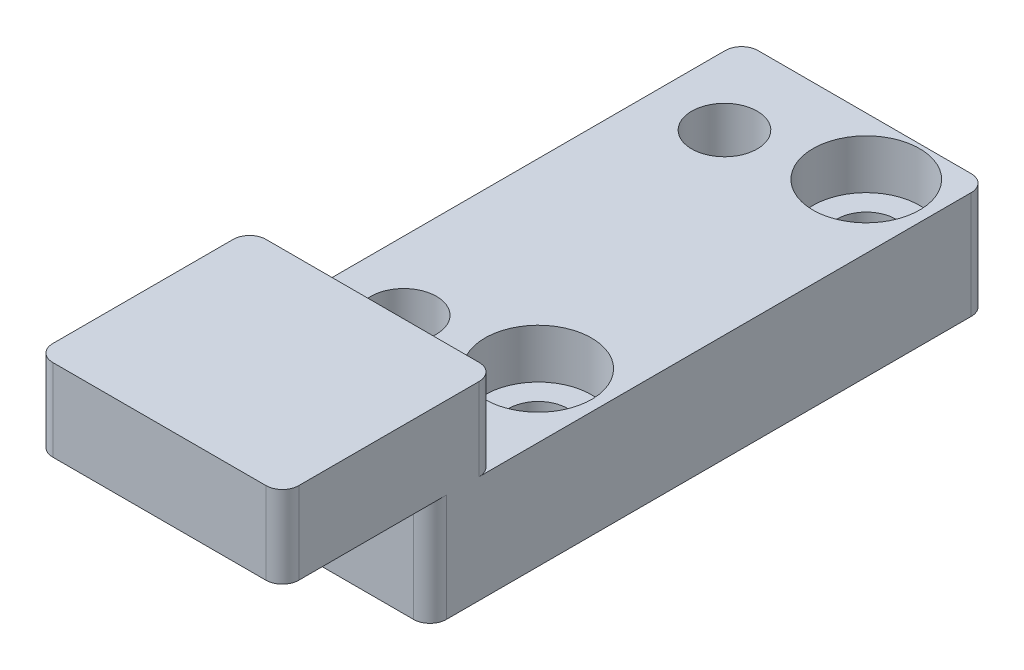
ISO-10303-21;
HEADER;
FILE_DESCRIPTION(('STEP AP214'),'2;1');
FILE_NAME('part.step','',(''),(''),'','','');
FILE_SCHEMA(('AUTOMOTIVE_DESIGN { 1 0 10303 214 1 1 1 1 }'));
ENDSEC;
DATA;
#1=APPLICATION_CONTEXT('core data for automotive mechanical design processes');
#2=APPLICATION_PROTOCOL_DEFINITION('international standard','automotive_design',2000,#1);
#3=PRODUCT_CONTEXT('',#1,'mechanical');
#4=PRODUCT('Part','Part','',(#3));
#5=PRODUCT_RELATED_PRODUCT_CATEGORY('part','',(#4));
#6=PRODUCT_DEFINITION_FORMATION('','',#4);
#7=PRODUCT_DEFINITION_CONTEXT('part definition',#1,'design');
#8=PRODUCT_DEFINITION('design','',#6,#7);
#9=PRODUCT_DEFINITION_SHAPE('','',#8);
#10=(LENGTH_UNIT() NAMED_UNIT(*) SI_UNIT(.MILLI.,.METRE.));
#11=(NAMED_UNIT(*) PLANE_ANGLE_UNIT() SI_UNIT($,.RADIAN.));
#12=(NAMED_UNIT(*) SI_UNIT($,.STERADIAN.) SOLID_ANGLE_UNIT());
#13=UNCERTAINTY_MEASURE_WITH_UNIT(LENGTH_MEASURE(1.E-05),#10,'distance_accuracy_value','');
#14=(GEOMETRIC_REPRESENTATION_CONTEXT(3) GLOBAL_UNCERTAINTY_ASSIGNED_CONTEXT((#13)) GLOBAL_UNIT_ASSIGNED_CONTEXT((#10,
#11,#12)) REPRESENTATION_CONTEXT('',''));
#15=CARTESIAN_POINT('',(0.,0.,0.));
#16=DIRECTION('',(0.,0.,1.));
#17=DIRECTION('',(1.,0.,0.));
#18=AXIS2_PLACEMENT_3D('',#15,#16,#17);
#19=CARTESIAN_POINT('',(0.,0.,30.));
#20=DIRECTION('',(0.,1.,0.));
#21=DIRECTION('',(0.,0.,1.));
#22=AXIS2_PLACEMENT_3D('',#19,#20,#21);
#23=PLANE('',#22);
#24=CARTESIAN_POINT('',(11.0999999999768,0.,3.49999999996773));
#25=DIRECTION('',(0.,1.,0.));
#26=DIRECTION('',(0.,0.,1.));
#27=AXIS2_PLACEMENT_3D('',#24,#25,#26);
#28=CIRCLE('',#27,1.8);
#29=CARTESIAN_POINT('',(11.0999999999768,0.,5.29999999996772));
#30=VERTEX_POINT('',#29);
#31=EDGE_CURVE('E277',#30,#30,#28,.T.);
#32=ORIENTED_EDGE('',*,*,#31,.T.);
#33=EDGE_LOOP('',(#32));
#34=FACE_BOUND('',#33,.T.);
#35=CARTESIAN_POINT('',(11.0999999999768,0.,23.4999999999677));
#36=DIRECTION('',(0.,1.,0.));
#37=DIRECTION('',(0.,0.,1.));
#38=AXIS2_PLACEMENT_3D('',#35,#36,#37);
#39=CIRCLE('',#38,1.8);
#40=CARTESIAN_POINT('',(11.0999999999768,0.,25.2999999999677));
#41=VERTEX_POINT('',#40);
#42=EDGE_CURVE('E263',#41,#41,#39,.T.);
#43=ORIENTED_EDGE('',*,*,#42,.T.);
#44=EDGE_LOOP('',(#43));
#45=FACE_BOUND('',#44,.T.);
#46=DIRECTION('',(0.,0.,-1.));
#47=VECTOR('',#46,1.);
#48=CARTESIAN_POINT('',(0.,0.,30.));
#49=LINE('',#48,#47);
#50=CARTESIAN_POINT('',(0.,0.,32.9999999999997));
#51=VERTEX_POINT('',#50);
#52=CARTESIAN_POINT('',(0.,0.,1.));
#53=VERTEX_POINT('',#52);
#54=EDGE_CURVE('E151',#51,#53,#49,.T.);
#55=ORIENTED_EDGE('',*,*,#54,.T.);
#56=CARTESIAN_POINT('',(1.,0.,1.));
#57=DIRECTION('',(0.,1.,0.));
#58=DIRECTION('',(0.,0.,1.));
#59=AXIS2_PLACEMENT_3D('',#56,#57,#58);
#60=CIRCLE('',#59,1.);
#61=CARTESIAN_POINT('',(1.,0.,0.));
#62=VERTEX_POINT('',#61);
#63=EDGE_CURVE('E184',#53,#62,#60,.F.);
#64=ORIENTED_EDGE('',*,*,#63,.T.);
#65=DIRECTION('',(1.,0.,0.));
#66=VECTOR('',#65,1.);
#67=CARTESIAN_POINT('',(0.,0.,0.));
#68=LINE('',#67,#66);
#69=CARTESIAN_POINT('',(14.,0.,0.));
#70=VERTEX_POINT('',#69);
#71=EDGE_CURVE('E261',#62,#70,#68,.T.);
#72=ORIENTED_EDGE('',*,*,#71,.T.);
#73=CARTESIAN_POINT('',(14.,0.,1.));
#74=DIRECTION('',(0.,1.,0.));
#75=DIRECTION('',(0.,0.,1.));
#76=AXIS2_PLACEMENT_3D('',#73,#74,#75);
#77=CIRCLE('',#76,1.);
#78=CARTESIAN_POINT('',(15.,0.,1.));
#79=VERTEX_POINT('',#78);
#80=EDGE_CURVE('E182',#70,#79,#77,.F.);
#81=ORIENTED_EDGE('',*,*,#80,.T.);
#82=DIRECTION('',(0.,0.,-1.));
#83=VECTOR('',#82,1.);
#84=CARTESIAN_POINT('',(15.,0.,30.));
#85=LINE('',#84,#83);
#86=CARTESIAN_POINT('',(15.,0.,32.9999999999997));
#87=VERTEX_POINT('',#86);
#88=EDGE_CURVE('E169',#87,#79,#85,.T.);
#89=ORIENTED_EDGE('',*,*,#88,.F.);
#90=CARTESIAN_POINT('',(14.,0.,32.9999999999997));
#91=DIRECTION('',(0.,1.,0.));
#92=DIRECTION('',(0.,0.,1.));
#93=AXIS2_PLACEMENT_3D('',#90,#91,#92);
#94=CIRCLE('',#93,1.);
#95=CARTESIAN_POINT('',(14.,0.,33.9999999999997));
#96=VERTEX_POINT('',#95);
#97=EDGE_CURVE('E157',#87,#96,#94,.F.);
#98=ORIENTED_EDGE('',*,*,#97,.T.);
#99=DIRECTION('',(-1.,0.,0.));
#100=VECTOR('',#99,1.);
#101=CARTESIAN_POINT('',(32.4023492954205,0.,33.9999999999997));
#102=LINE('',#101,#100);
#103=CARTESIAN_POINT('',(1.,0.,33.9999999999997));
#104=VERTEX_POINT('',#103);
#105=EDGE_CURVE('E153',#96,#104,#102,.T.);
#106=ORIENTED_EDGE('',*,*,#105,.T.);
#107=CARTESIAN_POINT('',(1.,0.,32.9999999999997));
#108=DIRECTION('',(0.,1.,0.));
#109=DIRECTION('',(0.,0.,1.));
#110=AXIS2_PLACEMENT_3D('',#107,#108,#109);
#111=CIRCLE('',#110,1.);
#112=EDGE_CURVE('E148',#104,#51,#111,.F.);
#113=ORIENTED_EDGE('',*,*,#112,.T.);
#114=EDGE_LOOP('',(#55,#64,#72,#81,#89,#98,#106,#113));
#115=FACE_BOUND('',#114,.T.);
#116=CARTESIAN_POINT('',(4.17499999999833,0.,5.22100000000145));
#117=DIRECTION('',(0.,-1.,0.));
#118=DIRECTION('',(0.,0.,-1.));
#119=AXIS2_PLACEMENT_3D('',#116,#117,#118);
#120=CIRCLE('',#119,3.57251);
#121=CARTESIAN_POINT('',(4.17499999999833,0.,1.64849000000145));
#122=VERTEX_POINT('',#121);
#123=EDGE_CURVE('E298',#122,#122,#120,.T.);
#124=ORIENTED_EDGE('',*,*,#123,.F.);
#125=EDGE_LOOP('',(#124));
#126=FACE_BOUND('',#125,.T.);
#127=CARTESIAN_POINT('',(4.17499999999827,0.,24.7790000000014));
#128=DIRECTION('',(0.,-1.,0.));
#129=DIRECTION('',(0.,0.,-1.));
#130=AXIS2_PLACEMENT_3D('',#127,#128,#129);
#131=CIRCLE('',#130,3.57251);
#132=CARTESIAN_POINT('',(4.17499999999827,0.,21.2064900000014));
#133=VERTEX_POINT('',#132);
#134=EDGE_CURVE('E310',#133,#133,#131,.T.);
#135=ORIENTED_EDGE('',*,*,#134,.F.);
#136=EDGE_LOOP('',(#135));
#137=FACE_BOUND('',#136,.T.);
#138=ADVANCED_FACE('F34',(#34,#45,#115,#126,#137),#23,.F.);
#139=CARTESIAN_POINT('',(0.,0.,30.));
#140=DIRECTION('',(1.,0.,0.));
#141=DIRECTION('',(0.,0.,-1.));
#142=AXIS2_PLACEMENT_3D('',#139,#140,#141);
#143=PLANE('',#142);
#144=DIRECTION('',(0.,0.,-1.));
#145=VECTOR('',#144,1.);
#146=CARTESIAN_POINT('',(0.,6.539,30.));
#147=LINE('',#146,#145);
#148=CARTESIAN_POINT('',(0.,6.539,30.9999999999998));
#149=VERTEX_POINT('',#148);
#150=CARTESIAN_POINT('',(0.,6.539,1.));
#151=VERTEX_POINT('',#150);
#152=EDGE_CURVE('E253',#149,#151,#147,.T.);
#153=ORIENTED_EDGE('',*,*,#152,.T.);
#154=DIRECTION('',(0.,-1.,0.));
#155=VECTOR('',#154,1.);
#156=CARTESIAN_POINT('',(0.,0.,1.));
#157=LINE('',#156,#155);
#158=EDGE_CURVE('E158',#151,#53,#157,.T.);
#159=ORIENTED_EDGE('',*,*,#158,.T.);
#160=ORIENTED_EDGE('',*,*,#54,.F.);
#161=DIRECTION('',(0.,1.,0.));
#162=VECTOR('',#161,1.);
#163=CARTESIAN_POINT('',(0.,6.56899999999228,32.9999999999997));
#164=LINE('',#163,#162);
#165=CARTESIAN_POINT('',(0.,6.56899999999228,32.9999999999997));
#166=VERTEX_POINT('',#165);
#167=EDGE_CURVE('E166',#51,#166,#164,.T.);
#168=ORIENTED_EDGE('',*,*,#167,.T.);
#169=DIRECTION('',(0.,0.,1.));
#170=VECTOR('',#169,1.);
#171=CARTESIAN_POINT('',(0.,6.56899999999228,33.9999999999997));
#172=LINE('',#171,#170);
#173=CARTESIAN_POINT('',(0.,6.56899999999228,41.9999999999997));
#174=VERTEX_POINT('',#173);
#175=EDGE_CURVE('E326',#166,#174,#172,.T.);
#176=ORIENTED_EDGE('',*,*,#175,.T.);
#177=DIRECTION('',(0.,1.,0.));
#178=VECTOR('',#177,1.);
#179=CARTESIAN_POINT('',(0.,11.5689999999923,41.9999999999997));
#180=LINE('',#179,#178);
#181=CARTESIAN_POINT('',(0.,11.5689999999923,41.9999999999997));
#182=VERTEX_POINT('',#181);
#183=EDGE_CURVE('E168',#174,#182,#180,.T.);
#184=ORIENTED_EDGE('',*,*,#183,.T.);
#185=DIRECTION('',(0.,0.,-1.));
#186=VECTOR('',#185,1.);
#187=CARTESIAN_POINT('',(0.,11.5689999999923,42.9999999999997));
#188=LINE('',#187,#186);
#189=CARTESIAN_POINT('',(0.,11.5689999999923,30.9999999999997));
#190=VERTEX_POINT('',#189);
#191=EDGE_CURVE('E315',#182,#190,#188,.T.);
#192=ORIENTED_EDGE('',*,*,#191,.T.);
#193=DIRECTION('',(0.,-1.,0.));
#194=VECTOR('',#193,1.);
#195=CARTESIAN_POINT('',(0.,6.53900000000003,30.9999999999998));
#196=LINE('',#195,#194);
#197=EDGE_CURVE('E173',#190,#149,#196,.T.);
#198=ORIENTED_EDGE('',*,*,#197,.T.);
#199=EDGE_LOOP('',(#153,#159,#160,#168,#176,#184,#192,#198));
#200=FACE_BOUND('',#199,.T.);
#201=ADVANCED_FACE('F164',(#200),#143,.F.);
#202=CARTESIAN_POINT('',(15.,0.,30.));
#203=DIRECTION('',(-1.,0.,0.));
#204=DIRECTION('',(0.,0.,1.));
#205=AXIS2_PLACEMENT_3D('',#202,#203,#204);
#206=PLANE('',#205);
#207=ORIENTED_EDGE('',*,*,#88,.T.);
#208=DIRECTION('',(0.,1.,0.));
#209=VECTOR('',#208,1.);
#210=CARTESIAN_POINT('',(15.,6.539,1.));
#211=LINE('',#210,#209);
#212=CARTESIAN_POINT('',(15.,6.539,1.));
#213=VERTEX_POINT('',#212);
#214=EDGE_CURVE('E215',#79,#213,#211,.T.);
#215=ORIENTED_EDGE('',*,*,#214,.T.);
#216=DIRECTION('',(0.,0.,-1.));
#217=VECTOR('',#216,1.);
#218=CARTESIAN_POINT('',(15.,6.539,30.));
#219=LINE('',#218,#217);
#220=CARTESIAN_POINT('',(15.,6.539,30.9999999999998));
#221=VERTEX_POINT('',#220);
#222=EDGE_CURVE('E250',#221,#213,#219,.T.);
#223=ORIENTED_EDGE('',*,*,#222,.F.);
#224=DIRECTION('',(0.,1.,0.));
#225=VECTOR('',#224,1.);
#226=CARTESIAN_POINT('',(15.,11.5689999999923,30.9999999999997));
#227=LINE('',#226,#225);
#228=CARTESIAN_POINT('',(15.,11.5689999999923,30.9999999999997));
#229=VERTEX_POINT('',#228);
#230=EDGE_CURVE('E212',#221,#229,#227,.T.);
#231=ORIENTED_EDGE('',*,*,#230,.T.);
#232=DIRECTION('',(0.,0.,1.));
#233=VECTOR('',#232,1.);
#234=CARTESIAN_POINT('',(15.,11.5689999999923,42.9999999999997));
#235=LINE('',#234,#233);
#236=CARTESIAN_POINT('',(15.,11.5689999999923,41.9999999999997));
#237=VERTEX_POINT('',#236);
#238=EDGE_CURVE('E313',#229,#237,#235,.T.);
#239=ORIENTED_EDGE('',*,*,#238,.T.);
#240=DIRECTION('',(0.,-1.,0.));
#241=VECTOR('',#240,1.);
#242=CARTESIAN_POINT('',(15.,6.56899999999228,41.9999999999997));
#243=LINE('',#242,#241);
#244=CARTESIAN_POINT('',(15.,6.56899999999228,41.9999999999997));
#245=VERTEX_POINT('',#244);
#246=EDGE_CURVE('E206',#237,#245,#243,.T.);
#247=ORIENTED_EDGE('',*,*,#246,.T.);
#248=DIRECTION('',(0.,0.,-1.));
#249=VECTOR('',#248,1.);
#250=CARTESIAN_POINT('',(15.,6.56899999999228,33.9999999999997));
#251=LINE('',#250,#249);
#252=CARTESIAN_POINT('',(15.,6.56899999999228,32.9999999999997));
#253=VERTEX_POINT('',#252);
#254=EDGE_CURVE('E237',#245,#253,#251,.T.);
#255=ORIENTED_EDGE('',*,*,#254,.T.);
#256=DIRECTION('',(0.,-1.,0.));
#257=VECTOR('',#256,1.);
#258=CARTESIAN_POINT('',(15.,0.,32.9999999999997));
#259=LINE('',#258,#257);
#260=EDGE_CURVE('E209',#253,#87,#259,.T.);
#261=ORIENTED_EDGE('',*,*,#260,.T.);
#262=EDGE_LOOP('',(#207,#215,#223,#231,#239,#247,#255,#261));
#263=FACE_BOUND('',#262,.T.);
#264=ADVANCED_FACE('F246',(#263),#206,.F.);
#265=CARTESIAN_POINT('',(0.,6.539,30.));
#266=DIRECTION('',(0.,-1.,0.));
#267=DIRECTION('',(0.,0.,-1.));
#268=AXIS2_PLACEMENT_3D('',#265,#266,#267);
#269=PLANE('',#268);
#270=CARTESIAN_POINT('',(4.17499999999827,6.539,24.7790000000014));
#271=DIRECTION('',(0.,-1.,0.));
#272=DIRECTION('',(0.,0.,-1.));
#273=AXIS2_PLACEMENT_3D('',#270,#271,#272);
#274=CIRCLE('',#273,1.998650054);
#275=CARTESIAN_POINT('',(4.17499999999827,6.539,22.7803499460015));
#276=VERTEX_POINT('',#275);
#277=EDGE_CURVE('E301',#276,#276,#274,.T.);
#278=ORIENTED_EDGE('',*,*,#277,.T.);
#279=EDGE_LOOP('',(#278));
#280=FACE_BOUND('',#279,.T.);
#281=CARTESIAN_POINT('',(4.17499999999833,6.539,5.22100000000145));
#282=DIRECTION('',(0.,-1.,0.));
#283=DIRECTION('',(0.,0.,-1.));
#284=AXIS2_PLACEMENT_3D('',#281,#282,#283);
#285=CIRCLE('',#284,1.998650054);
#286=CARTESIAN_POINT('',(4.17499999999833,6.539,3.22234994600145));
#287=VERTEX_POINT('',#286);
#288=EDGE_CURVE('E289',#287,#287,#285,.T.);
#289=ORIENTED_EDGE('',*,*,#288,.T.);
#290=EDGE_LOOP('',(#289));
#291=FACE_BOUND('',#290,.T.);
#292=CARTESIAN_POINT('',(11.0999999999768,6.539,3.49999999996773));
#293=DIRECTION('',(0.,1.,0.));
#294=DIRECTION('',(0.,0.,1.));
#295=AXIS2_PLACEMENT_3D('',#292,#293,#294);
#296=CIRCLE('',#295,3.25);
#297=CARTESIAN_POINT('',(11.0999999999768,6.539,6.74999999996773));
#298=VERTEX_POINT('',#297);
#299=EDGE_CURVE('E286',#298,#298,#296,.T.);
#300=ORIENTED_EDGE('',*,*,#299,.F.);
#301=EDGE_LOOP('',(#300));
#302=FACE_BOUND('',#301,.T.);
#303=CARTESIAN_POINT('',(11.0999999999768,6.539,23.4999999999677));
#304=DIRECTION('',(0.,1.,0.));
#305=DIRECTION('',(0.,0.,1.));
#306=AXIS2_PLACEMENT_3D('',#303,#304,#305);
#307=CIRCLE('',#306,3.25);
#308=CARTESIAN_POINT('',(11.0999999999768,6.539,26.7499999999677));
#309=VERTEX_POINT('',#308);
#310=EDGE_CURVE('E274',#309,#309,#307,.T.);
#311=ORIENTED_EDGE('',*,*,#310,.F.);
#312=EDGE_LOOP('',(#311));
#313=FACE_BOUND('',#312,.T.);
#314=DIRECTION('',(-1.,0.,0.));
#315=VECTOR('',#314,1.);
#316=CARTESIAN_POINT('',(0.,6.539,0.));
#317=LINE('',#316,#315);
#318=CARTESIAN_POINT('',(14.,6.539,0.));
#319=VERTEX_POINT('',#318);
#320=CARTESIAN_POINT('',(1.,6.539,0.));
#321=VERTEX_POINT('',#320);
#322=EDGE_CURVE('E258',#319,#321,#317,.T.);
#323=ORIENTED_EDGE('',*,*,#322,.T.);
#324=CARTESIAN_POINT('',(1.,6.539,1.));
#325=DIRECTION('',(0.,-1.,0.));
#326=DIRECTION('',(0.,0.,-1.));
#327=AXIS2_PLACEMENT_3D('',#324,#325,#326);
#328=CIRCLE('',#327,1.);
#329=EDGE_CURVE('E192',#321,#151,#328,.F.);
#330=ORIENTED_EDGE('',*,*,#329,.T.);
#331=ORIENTED_EDGE('',*,*,#152,.F.);
#332=CARTESIAN_POINT('',(1.,6.539,30.9999999999998));
#333=DIRECTION('',(0.,-1.,0.));
#334=DIRECTION('',(0.,0.,-1.));
#335=AXIS2_PLACEMENT_3D('',#332,#333,#334);
#336=CIRCLE('',#335,1.);
#337=CARTESIAN_POINT('',(1.,6.539,30.));
#338=VERTEX_POINT('',#337);
#339=EDGE_CURVE('E228',#149,#338,#336,.T.);
#340=ORIENTED_EDGE('',*,*,#339,.T.);
#341=DIRECTION('',(-1.,0.,0.));
#342=VECTOR('',#341,1.);
#343=CARTESIAN_POINT('',(0.,6.539,30.));
#344=LINE('',#343,#342);
#345=CARTESIAN_POINT('',(14.,6.539,30.));
#346=VERTEX_POINT('',#345);
#347=EDGE_CURVE('E257',#346,#338,#344,.T.);
#348=ORIENTED_EDGE('',*,*,#347,.F.);
#349=CARTESIAN_POINT('',(14.,6.539,30.9999999999998));
#350=DIRECTION('',(0.,-1.,0.));
#351=DIRECTION('',(0.,0.,-1.));
#352=AXIS2_PLACEMENT_3D('',#349,#350,#351);
#353=CIRCLE('',#352,1.);
#354=EDGE_CURVE('E230',#346,#221,#353,.T.);
#355=ORIENTED_EDGE('',*,*,#354,.T.);
#356=ORIENTED_EDGE('',*,*,#222,.T.);
#357=CARTESIAN_POINT('',(14.,6.539,1.));
#358=DIRECTION('',(0.,-1.,0.));
#359=DIRECTION('',(0.,0.,-1.));
#360=AXIS2_PLACEMENT_3D('',#357,#358,#359);
#361=CIRCLE('',#360,1.);
#362=EDGE_CURVE('E190',#213,#319,#361,.F.);
#363=ORIENTED_EDGE('',*,*,#362,.T.);
#364=EDGE_LOOP('',(#323,#330,#331,#340,#348,#355,#356,#363));
#365=FACE_BOUND('',#364,.T.);
#366=ADVANCED_FACE('F481',(#280,#291,#302,#313,#365),#269,.F.);
#367=CARTESIAN_POINT('',(0.,0.,0.));
#368=DIRECTION('',(0.,0.,-1.));
#369=DIRECTION('',(-1.,0.,0.));
#370=AXIS2_PLACEMENT_3D('',#367,#368,#369);
#371=PLANE('',#370);
#372=ORIENTED_EDGE('',*,*,#71,.F.);
#373=DIRECTION('',(0.,-1.,0.));
#374=VECTOR('',#373,1.);
#375=CARTESIAN_POINT('',(1.,6.539,0.));
#376=LINE('',#375,#374);
#377=EDGE_CURVE('E188',#62,#321,#376,.F.);
#378=ORIENTED_EDGE('',*,*,#377,.T.);
#379=ORIENTED_EDGE('',*,*,#322,.F.);
#380=DIRECTION('',(0.,1.,0.));
#381=VECTOR('',#380,1.);
#382=CARTESIAN_POINT('',(14.,0.,0.));
#383=LINE('',#382,#381);
#384=EDGE_CURVE('E186',#319,#70,#383,.F.);
#385=ORIENTED_EDGE('',*,*,#384,.T.);
#386=EDGE_LOOP('',(#372,#378,#379,#385));
#387=FACE_BOUND('',#386,.T.);
#388=ADVANCED_FACE('F475',(#387),#371,.T.);
#389=CARTESIAN_POINT('',(11.0999999999768,6.539,23.4999999999677));
#390=DIRECTION('',(0.,1.,0.));
#391=DIRECTION('',(0.,0.,1.));
#392=AXIS2_PLACEMENT_3D('',#389,#390,#391);
#393=CYLINDRICAL_SURFACE('',#392,1.8);
#394=ORIENTED_EDGE('',*,*,#42,.F.);
#395=EDGE_LOOP('',(#394));
#396=FACE_BOUND('',#395,.T.);
#397=CARTESIAN_POINT('',(11.0999999999768,3.539,23.4999999999677));
#398=DIRECTION('',(0.,1.,0.));
#399=DIRECTION('',(0.,0.,1.));
#400=AXIS2_PLACEMENT_3D('',#397,#398,#399);
#401=CIRCLE('',#400,1.8);
#402=CARTESIAN_POINT('',(11.0999999999768,3.539,25.2999999999677));
#403=VERTEX_POINT('',#402);
#404=EDGE_CURVE('E268',#403,#403,#401,.T.);
#405=ORIENTED_EDGE('',*,*,#404,.T.);
#406=EDGE_LOOP('',(#405));
#407=FACE_BOUND('',#406,.T.);
#408=ADVANCED_FACE('F480',(#396,#407),#393,.F.);
#409=CARTESIAN_POINT('',(12.8999999999768,3.539,23.4999999999677));
#410=DIRECTION('',(0.,-1.,0.));
#411=DIRECTION('',(0.,0.,-1.));
#412=AXIS2_PLACEMENT_3D('',#409,#410,#411);
#413=PLANE('',#412);
#414=ORIENTED_EDGE('',*,*,#404,.F.);
#415=EDGE_LOOP('',(#414));
#416=FACE_BOUND('',#415,.T.);
#417=CARTESIAN_POINT('',(11.0999999999768,3.539,23.4999999999677));
#418=DIRECTION('',(0.,1.,0.));
#419=DIRECTION('',(0.,0.,1.));
#420=AXIS2_PLACEMENT_3D('',#417,#418,#419);
#421=CIRCLE('',#420,3.25);
#422=CARTESIAN_POINT('',(11.0999999999768,3.539,26.7499999999677));
#423=VERTEX_POINT('',#422);
#424=EDGE_CURVE('E271',#423,#423,#421,.T.);
#425=ORIENTED_EDGE('',*,*,#424,.T.);
#426=EDGE_LOOP('',(#425));
#427=FACE_BOUND('',#426,.T.);
#428=ADVANCED_FACE('F609',(#416,#427),#413,.F.);
#429=CARTESIAN_POINT('',(11.0999999999768,6.539,23.4999999999677));
#430=DIRECTION('',(0.,1.,0.));
#431=DIRECTION('',(0.,0.,1.));
#432=AXIS2_PLACEMENT_3D('',#429,#430,#431);
#433=CYLINDRICAL_SURFACE('',#432,3.25);
#434=ORIENTED_EDGE('',*,*,#424,.F.);
#435=EDGE_LOOP('',(#434));
#436=FACE_BOUND('',#435,.T.);
#437=ORIENTED_EDGE('',*,*,#310,.T.);
#438=EDGE_LOOP('',(#437));
#439=FACE_BOUND('',#438,.T.);
#440=ADVANCED_FACE('F599',(#436,#439),#433,.F.);
#441=CARTESIAN_POINT('',(11.0999999999768,6.539,3.49999999996773));
#442=DIRECTION('',(0.,1.,0.));
#443=DIRECTION('',(0.,0.,1.));
#444=AXIS2_PLACEMENT_3D('',#441,#442,#443);
#445=CYLINDRICAL_SURFACE('',#444,1.8);
#446=ORIENTED_EDGE('',*,*,#31,.F.);
#447=EDGE_LOOP('',(#446));
#448=FACE_BOUND('',#447,.T.);
#449=CARTESIAN_POINT('',(11.0999999999768,3.539,3.49999999996773));
#450=DIRECTION('',(0.,1.,0.));
#451=DIRECTION('',(0.,0.,1.));
#452=AXIS2_PLACEMENT_3D('',#449,#450,#451);
#453=CIRCLE('',#452,1.8);
#454=CARTESIAN_POINT('',(11.0999999999768,3.539,5.29999999996773));
#455=VERTEX_POINT('',#454);
#456=EDGE_CURVE('E280',#455,#455,#453,.T.);
#457=ORIENTED_EDGE('',*,*,#456,.T.);
#458=EDGE_LOOP('',(#457));
#459=FACE_BOUND('',#458,.T.);
#460=ADVANCED_FACE('F589',(#448,#459),#445,.F.);
#461=CARTESIAN_POINT('',(12.8999999999768,3.539,3.49999999996773));
#462=DIRECTION('',(0.,-1.,0.));
#463=DIRECTION('',(0.,0.,-1.));
#464=AXIS2_PLACEMENT_3D('',#461,#462,#463);
#465=PLANE('',#464);
#466=ORIENTED_EDGE('',*,*,#456,.F.);
#467=EDGE_LOOP('',(#466));
#468=FACE_BOUND('',#467,.T.);
#469=CARTESIAN_POINT('',(11.0999999999768,3.539,3.49999999996773));
#470=DIRECTION('',(0.,1.,0.));
#471=DIRECTION('',(0.,0.,1.));
#472=AXIS2_PLACEMENT_3D('',#469,#470,#471);
#473=CIRCLE('',#472,3.25);
#474=CARTESIAN_POINT('',(11.0999999999768,3.539,6.74999999996773));
#475=VERTEX_POINT('',#474);
#476=EDGE_CURVE('E283',#475,#475,#473,.T.);
#477=ORIENTED_EDGE('',*,*,#476,.T.);
#478=EDGE_LOOP('',(#477));
#479=FACE_BOUND('',#478,.T.);
#480=ADVANCED_FACE('F579',(#468,#479),#465,.F.);
#481=CARTESIAN_POINT('',(11.0999999999768,6.539,3.49999999996773));
#482=DIRECTION('',(0.,1.,0.));
#483=DIRECTION('',(0.,0.,1.));
#484=AXIS2_PLACEMENT_3D('',#481,#482,#483);
#485=CYLINDRICAL_SURFACE('',#484,3.25);
#486=ORIENTED_EDGE('',*,*,#476,.F.);
#487=EDGE_LOOP('',(#486));
#488=FACE_BOUND('',#487,.T.);
#489=ORIENTED_EDGE('',*,*,#299,.T.);
#490=EDGE_LOOP('',(#489));
#491=FACE_BOUND('',#490,.T.);
#492=ADVANCED_FACE('F569',(#488,#491),#485,.F.);
#493=CARTESIAN_POINT('',(4.17499999999833,0.,5.22100000000145));
#494=DIRECTION('',(0.,-1.,0.));
#495=DIRECTION('',(0.,0.,-1.));
#496=AXIS2_PLACEMENT_3D('',#493,#494,#495);
#497=CYLINDRICAL_SURFACE('',#496,1.998650054);
#498=ORIENTED_EDGE('',*,*,#288,.F.);
#499=EDGE_LOOP('',(#498));
#500=FACE_BOUND('',#499,.T.);
#501=CARTESIAN_POINT('',(4.17499999999833,3.5052,5.22100000000145));
#502=DIRECTION('',(0.,-1.,0.));
#503=DIRECTION('',(0.,0.,-1.));
#504=AXIS2_PLACEMENT_3D('',#501,#502,#503);
#505=CIRCLE('',#504,1.998650054);
#506=CARTESIAN_POINT('',(4.17499999999833,3.5052,3.22234994600145));
#507=VERTEX_POINT('',#506);
#508=EDGE_CURVE('E292',#507,#507,#505,.T.);
#509=ORIENTED_EDGE('',*,*,#508,.T.);
#510=EDGE_LOOP('',(#509));
#511=FACE_BOUND('',#510,.T.);
#512=ADVANCED_FACE('F559',(#500,#511),#497,.F.);
#513=CARTESIAN_POINT('',(6.17365005399833,3.5052,5.22100000000145));
#514=DIRECTION('',(0.,1.,0.));
#515=DIRECTION('',(0.,0.,1.));
#516=AXIS2_PLACEMENT_3D('',#513,#514,#515);
#517=PLANE('',#516);
#518=ORIENTED_EDGE('',*,*,#508,.F.);
#519=EDGE_LOOP('',(#518));
#520=FACE_BOUND('',#519,.T.);
#521=CARTESIAN_POINT('',(4.17499999999833,3.5052,5.22100000000145));
#522=DIRECTION('',(0.,-1.,0.));
#523=DIRECTION('',(0.,0.,-1.));
#524=AXIS2_PLACEMENT_3D('',#521,#522,#523);
#525=CIRCLE('',#524,3.57251);
#526=CARTESIAN_POINT('',(4.17499999999833,3.5052,1.64849000000145));
#527=VERTEX_POINT('',#526);
#528=EDGE_CURVE('E295',#527,#527,#525,.T.);
#529=ORIENTED_EDGE('',*,*,#528,.T.);
#530=EDGE_LOOP('',(#529));
#531=FACE_BOUND('',#530,.T.);
#532=ADVANCED_FACE('F549',(#520,#531),#517,.F.);
#533=CARTESIAN_POINT('',(4.17499999999833,0.,5.22100000000145));
#534=DIRECTION('',(0.,-1.,0.));
#535=DIRECTION('',(0.,0.,-1.));
#536=AXIS2_PLACEMENT_3D('',#533,#534,#535);
#537=CYLINDRICAL_SURFACE('',#536,3.57251);
#538=ORIENTED_EDGE('',*,*,#528,.F.);
#539=EDGE_LOOP('',(#538));
#540=FACE_BOUND('',#539,.T.);
#541=ORIENTED_EDGE('',*,*,#123,.T.);
#542=EDGE_LOOP('',(#541));
#543=FACE_BOUND('',#542,.T.);
#544=ADVANCED_FACE('F539',(#540,#543),#537,.F.);
#545=CARTESIAN_POINT('',(4.17499999999827,0.,24.7790000000014));
#546=DIRECTION('',(0.,-1.,0.));
#547=DIRECTION('',(0.,0.,-1.));
#548=AXIS2_PLACEMENT_3D('',#545,#546,#547);
#549=CYLINDRICAL_SURFACE('',#548,1.998650054);
#550=ORIENTED_EDGE('',*,*,#277,.F.);
#551=EDGE_LOOP('',(#550));
#552=FACE_BOUND('',#551,.T.);
#553=CARTESIAN_POINT('',(4.17499999999827,3.5052,24.7790000000014));
#554=DIRECTION('',(0.,-1.,0.));
#555=DIRECTION('',(0.,0.,-1.));
#556=AXIS2_PLACEMENT_3D('',#553,#554,#555);
#557=CIRCLE('',#556,1.998650054);
#558=CARTESIAN_POINT('',(4.17499999999827,3.5052,22.7803499460015));
#559=VERTEX_POINT('',#558);
#560=EDGE_CURVE('E304',#559,#559,#557,.T.);
#561=ORIENTED_EDGE('',*,*,#560,.T.);
#562=EDGE_LOOP('',(#561));
#563=FACE_BOUND('',#562,.T.);
#564=ADVANCED_FACE('F529',(#552,#563),#549,.F.);
#565=CARTESIAN_POINT('',(6.17365005399827,3.5052,24.7790000000014));
#566=DIRECTION('',(0.,1.,0.));
#567=DIRECTION('',(0.,0.,1.));
#568=AXIS2_PLACEMENT_3D('',#565,#566,#567);
#569=PLANE('',#568);
#570=ORIENTED_EDGE('',*,*,#560,.F.);
#571=EDGE_LOOP('',(#570));
#572=FACE_BOUND('',#571,.T.);
#573=CARTESIAN_POINT('',(4.17499999999827,3.5052,24.7790000000014));
#574=DIRECTION('',(0.,-1.,0.));
#575=DIRECTION('',(0.,0.,-1.));
#576=AXIS2_PLACEMENT_3D('',#573,#574,#575);
#577=CIRCLE('',#576,3.57251);
#578=CARTESIAN_POINT('',(4.17499999999827,3.5052,21.2064900000015));
#579=VERTEX_POINT('',#578);
#580=EDGE_CURVE('E307',#579,#579,#577,.T.);
#581=ORIENTED_EDGE('',*,*,#580,.T.);
#582=EDGE_LOOP('',(#581));
#583=FACE_BOUND('',#582,.T.);
#584=ADVANCED_FACE('F519',(#572,#583),#569,.F.);
#585=CARTESIAN_POINT('',(4.17499999999827,0.,24.7790000000014));
#586=DIRECTION('',(0.,-1.,0.));
#587=DIRECTION('',(0.,0.,-1.));
#588=AXIS2_PLACEMENT_3D('',#585,#586,#587);
#589=CYLINDRICAL_SURFACE('',#588,3.57251);
#590=ORIENTED_EDGE('',*,*,#580,.F.);
#591=EDGE_LOOP('',(#590));
#592=FACE_BOUND('',#591,.T.);
#593=ORIENTED_EDGE('',*,*,#134,.T.);
#594=EDGE_LOOP('',(#593));
#595=FACE_BOUND('',#594,.T.);
#596=ADVANCED_FACE('F468',(#592,#595),#589,.F.);
#597=CARTESIAN_POINT('',(32.4023492954205,11.5689999999923,29.9999999999997));
#598=DIRECTION('',(0.,0.,-1.));
#599=DIRECTION('',(0.,1.,0.));
#600=AXIS2_PLACEMENT_3D('',#597,#598,#599);
#601=PLANE('',#600);
#602=ORIENTED_EDGE('',*,*,#347,.T.);
#603=DIRECTION('',(0.,-1.,0.));
#604=VECTOR('',#603,1.);
#605=CARTESIAN_POINT('',(1.,11.5689999999923,29.9999999999997));
#606=LINE('',#605,#604);
#607=CARTESIAN_POINT('',(1.,11.5689999999923,29.9999999999997));
#608=VERTEX_POINT('',#607);
#609=EDGE_CURVE('E196',#338,#608,#606,.F.);
#610=ORIENTED_EDGE('',*,*,#609,.T.);
#611=DIRECTION('',(-1.,0.,0.));
#612=VECTOR('',#611,1.);
#613=CARTESIAN_POINT('',(32.4023492954205,11.5689999999923,29.9999999999997));
#614=LINE('',#613,#612);
#615=CARTESIAN_POINT('',(14.,11.5689999999923,29.9999999999997));
#616=VERTEX_POINT('',#615);
#617=EDGE_CURVE('E321',#616,#608,#614,.T.);
#618=ORIENTED_EDGE('',*,*,#617,.F.);
#619=DIRECTION('',(0.,1.,0.));
#620=VECTOR('',#619,1.);
#621=CARTESIAN_POINT('',(14.,6.539,29.9999999999998));
#622=LINE('',#621,#620);
#623=EDGE_CURVE('E194',#616,#346,#622,.F.);
#624=ORIENTED_EDGE('',*,*,#623,.T.);
#625=EDGE_LOOP('',(#602,#610,#618,#624));
#626=FACE_BOUND('',#625,.T.);
#627=ADVANCED_FACE('F459',(#626),#601,.T.);
#628=CARTESIAN_POINT('',(32.4023492954205,11.5689999999923,42.9999999999997));
#629=DIRECTION('',(0.,1.,0.));
#630=DIRECTION('',(0.,0.,1.));
#631=AXIS2_PLACEMENT_3D('',#628,#629,#630);
#632=PLANE('',#631);
#633=ORIENTED_EDGE('',*,*,#617,.T.);
#634=CARTESIAN_POINT('',(1.,11.5689999999923,30.9999999999997));
#635=DIRECTION('',(0.,1.,0.));
#636=DIRECTION('',(0.,0.,1.));
#637=AXIS2_PLACEMENT_3D('',#634,#635,#636);
#638=CIRCLE('',#637,1.);
#639=EDGE_CURVE('E204',#608,#190,#638,.T.);
#640=ORIENTED_EDGE('',*,*,#639,.T.);
#641=ORIENTED_EDGE('',*,*,#191,.F.);
#642=CARTESIAN_POINT('',(1.,11.5689999999923,41.9999999999997));
#643=DIRECTION('',(0.,1.,0.));
#644=DIRECTION('',(0.,0.,1.));
#645=AXIS2_PLACEMENT_3D('',#642,#643,#644);
#646=CIRCLE('',#645,1.);
#647=CARTESIAN_POINT('',(1.,11.5689999999923,42.9999999999997));
#648=VERTEX_POINT('',#647);
#649=EDGE_CURVE('E200',#182,#648,#646,.T.);
#650=ORIENTED_EDGE('',*,*,#649,.T.);
#651=DIRECTION('',(-1.,0.,0.));
#652=VECTOR('',#651,1.);
#653=CARTESIAN_POINT('',(32.4023492954205,11.5689999999923,42.9999999999997));
#654=LINE('',#653,#652);
#655=CARTESIAN_POINT('',(14.,11.5689999999923,42.9999999999997));
#656=VERTEX_POINT('',#655);
#657=EDGE_CURVE('E319',#656,#648,#654,.T.);
#658=ORIENTED_EDGE('',*,*,#657,.F.);
#659=CARTESIAN_POINT('',(14.,11.5689999999923,41.9999999999997));
#660=DIRECTION('',(0.,1.,0.));
#661=DIRECTION('',(0.,0.,1.));
#662=AXIS2_PLACEMENT_3D('',#659,#660,#661);
#663=CIRCLE('',#662,1.);
#664=EDGE_CURVE('E198',#656,#237,#663,.T.);
#665=ORIENTED_EDGE('',*,*,#664,.T.);
#666=ORIENTED_EDGE('',*,*,#238,.F.);
#667=CARTESIAN_POINT('',(14.,11.5689999999923,30.9999999999997));
#668=DIRECTION('',(0.,1.,0.));
#669=DIRECTION('',(0.,0.,1.));
#670=AXIS2_PLACEMENT_3D('',#667,#668,#669);
#671=CIRCLE('',#670,1.);
#672=EDGE_CURVE('E202',#229,#616,#671,.T.);
#673=ORIENTED_EDGE('',*,*,#672,.T.);
#674=EDGE_LOOP('',(#633,#640,#641,#650,#658,#665,#666,#673));
#675=FACE_BOUND('',#674,.T.);
#676=ADVANCED_FACE('F339',(#675),#632,.T.);
#677=CARTESIAN_POINT('',(32.4023492954205,6.56899999999228,42.9999999999997));
#678=DIRECTION('',(0.,0.,1.));
#679=DIRECTION('',(1.,0.,0.));
#680=AXIS2_PLACEMENT_3D('',#677,#678,#679);
#681=PLANE('',#680);
#682=ORIENTED_EDGE('',*,*,#657,.T.);
#683=DIRECTION('',(0.,1.,0.));
#684=VECTOR('',#683,1.);
#685=CARTESIAN_POINT('',(1.,6.56899999999228,42.9999999999997));
#686=LINE('',#685,#684);
#687=CARTESIAN_POINT('',(1.,6.56899999999228,42.9999999999997));
#688=VERTEX_POINT('',#687);
#689=EDGE_CURVE('E49',#648,#688,#686,.F.);
#690=ORIENTED_EDGE('',*,*,#689,.T.);
#691=DIRECTION('',(-1.,0.,0.));
#692=VECTOR('',#691,1.);
#693=CARTESIAN_POINT('',(32.4023492954205,6.56899999999228,42.9999999999997));
#694=LINE('',#693,#692);
#695=CARTESIAN_POINT('',(14.,6.56899999999228,42.9999999999997));
#696=VERTEX_POINT('',#695);
#697=EDGE_CURVE('E317',#696,#688,#694,.T.);
#698=ORIENTED_EDGE('',*,*,#697,.F.);
#699=DIRECTION('',(0.,-1.,0.));
#700=VECTOR('',#699,1.);
#701=CARTESIAN_POINT('',(14.,11.5689999999923,42.9999999999997));
#702=LINE('',#701,#700);
#703=EDGE_CURVE('E222',#696,#656,#702,.F.);
#704=ORIENTED_EDGE('',*,*,#703,.T.);
#705=EDGE_LOOP('',(#682,#690,#698,#704));
#706=FACE_BOUND('',#705,.T.);
#707=ADVANCED_FACE('F338',(#706),#681,.T.);
#708=CARTESIAN_POINT('',(32.4023492954205,6.56899999999228,33.9999999999997));
#709=DIRECTION('',(0.,-1.,0.));
#710=DIRECTION('',(0.,0.,-1.));
#711=AXIS2_PLACEMENT_3D('',#708,#709,#710);
#712=PLANE('',#711);
#713=ORIENTED_EDGE('',*,*,#697,.T.);
#714=CARTESIAN_POINT('',(1.,6.56899999999228,41.9999999999997));
#715=DIRECTION('',(0.,-1.,0.));
#716=DIRECTION('',(0.,0.,-1.));
#717=AXIS2_PLACEMENT_3D('',#714,#715,#716);
#718=CIRCLE('',#717,1.);
#719=EDGE_CURVE('E226',#688,#174,#718,.T.);
#720=ORIENTED_EDGE('',*,*,#719,.T.);
#721=ORIENTED_EDGE('',*,*,#175,.F.);
#722=CARTESIAN_POINT('',(1.,6.56899999999228,32.9999999999997));
#723=DIRECTION('',(0.,-1.,0.));
#724=DIRECTION('',(0.,0.,-1.));
#725=AXIS2_PLACEMENT_3D('',#722,#723,#724);
#726=CIRCLE('',#725,1.);
#727=CARTESIAN_POINT('',(1.,6.56899999999228,33.9999999999997));
#728=VERTEX_POINT('',#727);
#729=EDGE_CURVE('E11',#166,#728,#726,.F.);
#730=ORIENTED_EDGE('',*,*,#729,.T.);
#731=DIRECTION('',(-1.,0.,0.));
#732=VECTOR('',#731,1.);
#733=CARTESIAN_POINT('',(32.4023492954205,6.56899999999228,33.9999999999997));
#734=LINE('',#733,#732);
#735=CARTESIAN_POINT('',(14.,6.56899999999228,33.9999999999997));
#736=VERTEX_POINT('',#735);
#737=EDGE_CURVE('E239',#736,#728,#734,.T.);
#738=ORIENTED_EDGE('',*,*,#737,.F.);
#739=CARTESIAN_POINT('',(14.,6.56899999999228,32.9999999999997));
#740=DIRECTION('',(0.,-1.,0.));
#741=DIRECTION('',(0.,0.,-1.));
#742=AXIS2_PLACEMENT_3D('',#739,#740,#741);
#743=CIRCLE('',#742,1.);
#744=EDGE_CURVE('E42',#736,#253,#743,.F.);
#745=ORIENTED_EDGE('',*,*,#744,.T.);
#746=ORIENTED_EDGE('',*,*,#254,.F.);
#747=CARTESIAN_POINT('',(14.,6.56899999999228,41.9999999999997));
#748=DIRECTION('',(0.,-1.,0.));
#749=DIRECTION('',(0.,0.,-1.));
#750=AXIS2_PLACEMENT_3D('',#747,#748,#749);
#751=CIRCLE('',#750,1.);
#752=EDGE_CURVE('E56',#245,#696,#751,.T.);
#753=ORIENTED_EDGE('',*,*,#752,.T.);
#754=EDGE_LOOP('',(#713,#720,#721,#730,#738,#745,#746,#753));
#755=FACE_BOUND('',#754,.T.);
#756=ADVANCED_FACE('F236',(#755),#712,.T.);
#757=CARTESIAN_POINT('',(32.4023492954205,0.,33.9999999999997));
#758=DIRECTION('',(0.,0.,1.));
#759=DIRECTION('',(1.,0.,0.));
#760=AXIS2_PLACEMENT_3D('',#757,#758,#759);
#761=PLANE('',#760);
#762=ORIENTED_EDGE('',*,*,#105,.F.);
#763=DIRECTION('',(0.,-1.,0.));
#764=VECTOR('',#763,1.);
#765=CARTESIAN_POINT('',(14.,6.56899999999228,33.9999999999997));
#766=LINE('',#765,#764);
#767=EDGE_CURVE('E220',#96,#736,#766,.F.);
#768=ORIENTED_EDGE('',*,*,#767,.T.);
#769=ORIENTED_EDGE('',*,*,#737,.T.);
#770=DIRECTION('',(0.,1.,0.));
#771=VECTOR('',#770,1.);
#772=CARTESIAN_POINT('',(1.,0.,33.9999999999997));
#773=LINE('',#772,#771);
#774=EDGE_CURVE('E218',#728,#104,#773,.F.);
#775=ORIENTED_EDGE('',*,*,#774,.T.);
#776=EDGE_LOOP('',(#762,#768,#769,#775));
#777=FACE_BOUND('',#776,.T.);
#778=ADVANCED_FACE('F347',(#777),#761,.T.);
#779=CARTESIAN_POINT('',(1.,0.,1.));
#780=DIRECTION('',(0.,1.,0.));
#781=DIRECTION('',(0.,0.,1.));
#782=AXIS2_PLACEMENT_3D('',#779,#780,#781);
#783=CYLINDRICAL_SURFACE('',#782,1.);
#784=ORIENTED_EDGE('',*,*,#329,.F.);
#785=ORIENTED_EDGE('',*,*,#377,.F.);
#786=ORIENTED_EDGE('',*,*,#63,.F.);
#787=ORIENTED_EDGE('',*,*,#158,.F.);
#788=EDGE_LOOP('',(#784,#785,#786,#787));
#789=FACE_BOUND('',#788,.T.);
#790=ADVANCED_FACE('F349',(#789),#783,.T.);
#791=CARTESIAN_POINT('',(1.,0.,31.));
#792=DIRECTION('',(0.,1.,0.));
#793=DIRECTION('',(0.,0.,1.));
#794=AXIS2_PLACEMENT_3D('',#791,#792,#793);
#795=CYLINDRICAL_SURFACE('',#794,1.);
#796=ORIENTED_EDGE('',*,*,#639,.F.);
#797=ORIENTED_EDGE('',*,*,#609,.F.);
#798=ORIENTED_EDGE('',*,*,#339,.F.);
#799=ORIENTED_EDGE('',*,*,#197,.F.);
#800=EDGE_LOOP('',(#796,#797,#798,#799));
#801=FACE_BOUND('',#800,.T.);
#802=ADVANCED_FACE('F355',(#801),#795,.T.);
#803=CARTESIAN_POINT('',(14.,0.,1.));
#804=DIRECTION('',(0.,-1.,0.));
#805=DIRECTION('',(0.,0.,-1.));
#806=AXIS2_PLACEMENT_3D('',#803,#804,#805);
#807=CYLINDRICAL_SURFACE('',#806,1.);
#808=ORIENTED_EDGE('',*,*,#80,.F.);
#809=ORIENTED_EDGE('',*,*,#384,.F.);
#810=ORIENTED_EDGE('',*,*,#362,.F.);
#811=ORIENTED_EDGE('',*,*,#214,.F.);
#812=EDGE_LOOP('',(#808,#809,#810,#811));
#813=FACE_BOUND('',#812,.T.);
#814=ADVANCED_FACE('F373',(#813),#807,.T.);
#815=CARTESIAN_POINT('',(14.,0.,31.));
#816=DIRECTION('',(0.,-1.,0.));
#817=DIRECTION('',(0.,0.,-1.));
#818=AXIS2_PLACEMENT_3D('',#815,#816,#817);
#819=CYLINDRICAL_SURFACE('',#818,1.);
#820=ORIENTED_EDGE('',*,*,#354,.F.);
#821=ORIENTED_EDGE('',*,*,#623,.F.);
#822=ORIENTED_EDGE('',*,*,#672,.F.);
#823=ORIENTED_EDGE('',*,*,#230,.F.);
#824=EDGE_LOOP('',(#820,#821,#822,#823));
#825=FACE_BOUND('',#824,.T.);
#826=ADVANCED_FACE('F377',(#825),#819,.T.);
#827=CARTESIAN_POINT('',(14.,0.,32.9999999999997));
#828=DIRECTION('',(0.,1.,0.));
#829=DIRECTION('',(0.,0.,1.));
#830=AXIS2_PLACEMENT_3D('',#827,#828,#829);
#831=CYLINDRICAL_SURFACE('',#830,1.);
#832=ORIENTED_EDGE('',*,*,#744,.F.);
#833=ORIENTED_EDGE('',*,*,#767,.F.);
#834=ORIENTED_EDGE('',*,*,#97,.F.);
#835=ORIENTED_EDGE('',*,*,#260,.F.);
#836=EDGE_LOOP('',(#832,#833,#834,#835));
#837=FACE_BOUND('',#836,.T.);
#838=ADVANCED_FACE('F242',(#837),#831,.T.);
#839=CARTESIAN_POINT('',(1.,0.,32.9999999999997));
#840=DIRECTION('',(0.,-1.,0.));
#841=DIRECTION('',(0.,0.,-1.));
#842=AXIS2_PLACEMENT_3D('',#839,#840,#841);
#843=CYLINDRICAL_SURFACE('',#842,1.);
#844=ORIENTED_EDGE('',*,*,#112,.F.);
#845=ORIENTED_EDGE('',*,*,#774,.F.);
#846=ORIENTED_EDGE('',*,*,#729,.F.);
#847=ORIENTED_EDGE('',*,*,#167,.F.);
#848=EDGE_LOOP('',(#844,#845,#846,#847));
#849=FACE_BOUND('',#848,.T.);
#850=ADVANCED_FACE('F172',(#849),#843,.T.);
#851=CARTESIAN_POINT('',(1.,0.,41.9999999999997));
#852=DIRECTION('',(0.,-1.,0.));
#853=DIRECTION('',(0.,0.,-1.));
#854=AXIS2_PLACEMENT_3D('',#851,#852,#853);
#855=CYLINDRICAL_SURFACE('',#854,1.);
#856=ORIENTED_EDGE('',*,*,#719,.F.);
#857=ORIENTED_EDGE('',*,*,#689,.F.);
#858=ORIENTED_EDGE('',*,*,#649,.F.);
#859=ORIENTED_EDGE('',*,*,#183,.F.);
#860=EDGE_LOOP('',(#856,#857,#858,#859));
#861=FACE_BOUND('',#860,.T.);
#862=ADVANCED_FACE('F344',(#861),#855,.T.);
#863=CARTESIAN_POINT('',(14.,0.,41.9999999999997));
#864=DIRECTION('',(0.,1.,0.));
#865=DIRECTION('',(0.,0.,1.));
#866=AXIS2_PLACEMENT_3D('',#863,#864,#865);
#867=CYLINDRICAL_SURFACE('',#866,1.);
#868=ORIENTED_EDGE('',*,*,#664,.F.);
#869=ORIENTED_EDGE('',*,*,#703,.F.);
#870=ORIENTED_EDGE('',*,*,#752,.F.);
#871=ORIENTED_EDGE('',*,*,#246,.F.);
#872=EDGE_LOOP('',(#868,#869,#870,#871));
#873=FACE_BOUND('',#872,.T.);
#874=ADVANCED_FACE('F36',(#873),#867,.T.);
#875=CLOSED_SHELL('',(#138,#201,#264,#366,#388,#408,#428,#440,#460,#480,#492,#512,#532,#544,
#564,#584,#596,#627,#676,#707,#756,#778,#790,#802,#814,#826,#838,#850,#862,#874));
#876=MANIFOLD_SOLID_BREP('B2',#875);
#877=ADVANCED_BREP_SHAPE_REPRESENTATION('',(#18,#876),#14);
#878=SHAPE_DEFINITION_REPRESENTATION(#9,#877);
ENDSEC;
END-ISO-10303-21;
